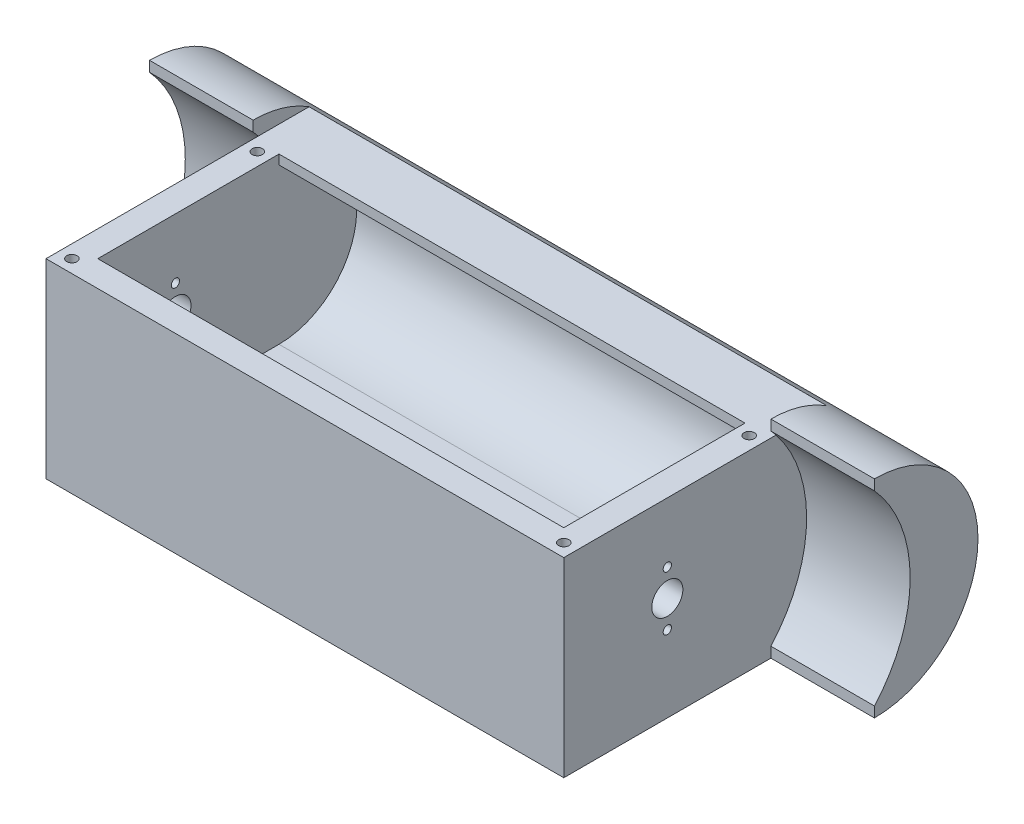
ISO-10303-21;
HEADER;
FILE_DESCRIPTION(('STEP AP214'),'2;1');
FILE_NAME('part.step','',(''),(''),'','','');
FILE_SCHEMA(('AUTOMOTIVE_DESIGN { 1 0 10303 214 1 1 1 1 }'));
ENDSEC;
DATA;
#1=APPLICATION_CONTEXT('core data for automotive mechanical design processes');
#2=APPLICATION_PROTOCOL_DEFINITION('international standard','automotive_design',2000,#1);
#3=PRODUCT_CONTEXT('',#1,'mechanical');
#4=PRODUCT('Part','Part','',(#3));
#5=PRODUCT_RELATED_PRODUCT_CATEGORY('part','',(#4));
#6=PRODUCT_DEFINITION_FORMATION('','',#4);
#7=PRODUCT_DEFINITION_CONTEXT('part definition',#1,'design');
#8=PRODUCT_DEFINITION('design','',#6,#7);
#9=PRODUCT_DEFINITION_SHAPE('','',#8);
#10=(LENGTH_UNIT() NAMED_UNIT(*) SI_UNIT(.MILLI.,.METRE.));
#11=(NAMED_UNIT(*) PLANE_ANGLE_UNIT() SI_UNIT($,.RADIAN.));
#12=(NAMED_UNIT(*) SI_UNIT($,.STERADIAN.) SOLID_ANGLE_UNIT());
#13=UNCERTAINTY_MEASURE_WITH_UNIT(LENGTH_MEASURE(1.E-05),#10,'distance_accuracy_value','');
#14=(GEOMETRIC_REPRESENTATION_CONTEXT(3) GLOBAL_UNCERTAINTY_ASSIGNED_CONTEXT((#13)) GLOBAL_UNIT_ASSIGNED_CONTEXT((#10,
#11,#12)) REPRESENTATION_CONTEXT('',''));
#15=CARTESIAN_POINT('',(0.,0.,0.));
#16=DIRECTION('',(0.,0.,1.));
#17=DIRECTION('',(1.,0.,0.));
#18=AXIS2_PLACEMENT_3D('',#15,#16,#17);
#19=CARTESIAN_POINT('',(-20.,20.,-20.));
#20=DIRECTION('',(0.,0.,1.));
#21=DIRECTION('',(0.,-1.,0.));
#22=AXIS2_PLACEMENT_3D('',#19,#20,#21);
#23=PLANE('',#22);
#24=DIRECTION('',(-1.,0.,0.));
#25=VECTOR('',#24,1.);
#26=CARTESIAN_POINT('',(36.634000600535,17.9891634046723,-20.));
#27=LINE('',#26,#25);
#28=CARTESIAN_POINT('',(0.,17.9891634046723,-20.));
#29=VERTEX_POINT('',#28);
#30=CARTESIAN_POINT('',(-20.,17.9891634046723,-20.));
#31=VERTEX_POINT('',#30);
#32=EDGE_CURVE('E183',#29,#31,#27,.T.);
#33=ORIENTED_EDGE('',*,*,#32,.F.);
#34=DIRECTION('',(0.,-1.,0.));
#35=VECTOR('',#34,1.);
#36=CARTESIAN_POINT('',(0.,20.,-20.));
#37=LINE('',#36,#35);
#38=CARTESIAN_POINT('',(0.,20.,-20.));
#39=VERTEX_POINT('',#38);
#40=EDGE_CURVE('E208',#39,#29,#37,.T.);
#41=ORIENTED_EDGE('',*,*,#40,.F.);
#42=DIRECTION('',(1.,0.,0.));
#43=VECTOR('',#42,1.);
#44=CARTESIAN_POINT('',(-20.,20.,-20.));
#45=LINE('',#44,#43);
#46=CARTESIAN_POINT('',(-20.,20.,-20.));
#47=VERTEX_POINT('',#46);
#48=EDGE_CURVE('E207',#47,#39,#45,.T.);
#49=ORIENTED_EDGE('',*,*,#48,.F.);
#50=DIRECTION('',(0.,-1.,0.));
#51=VECTOR('',#50,1.);
#52=CARTESIAN_POINT('',(-20.,20.,-20.));
#53=LINE('',#52,#51);
#54=EDGE_CURVE('E203',#47,#31,#53,.T.);
#55=ORIENTED_EDGE('',*,*,#54,.T.);
#56=EDGE_LOOP('',(#33,#41,#49,#55));
#57=FACE_BOUND('',#56,.T.);
#58=ADVANCED_FACE('F48',(#57),#23,.T.);
#59=CARTESIAN_POINT('',(120.,20.,-20.));
#60=DIRECTION('',(0.,0.,-1.));
#61=DIRECTION('',(0.,1.,0.));
#62=AXIS2_PLACEMENT_3D('',#59,#60,#61);
#63=PLANE('',#62);
#64=DIRECTION('',(0.,-1.,0.));
#65=VECTOR('',#64,1.);
#66=CARTESIAN_POINT('',(100.,20.,-20.));
#67=LINE('',#66,#65);
#68=CARTESIAN_POINT('',(100.,20.,-20.));
#69=VERTEX_POINT('',#68);
#70=CARTESIAN_POINT('',(100.,17.9891634046723,-20.));
#71=VERTEX_POINT('',#70);
#72=EDGE_CURVE('E227',#69,#71,#67,.T.);
#73=ORIENTED_EDGE('',*,*,#72,.T.);
#74=DIRECTION('',(1.,0.,0.));
#75=VECTOR('',#74,1.);
#76=CARTESIAN_POINT('',(63.365999399465,17.9891634046723,-20.));
#77=LINE('',#76,#75);
#78=CARTESIAN_POINT('',(120.,17.9891634046723,-20.));
#79=VERTEX_POINT('',#78);
#80=EDGE_CURVE('E416',#71,#79,#77,.T.);
#81=ORIENTED_EDGE('',*,*,#80,.T.);
#82=DIRECTION('',(0.,-1.,0.));
#83=VECTOR('',#82,1.);
#84=CARTESIAN_POINT('',(120.,20.,-20.));
#85=LINE('',#84,#83);
#86=CARTESIAN_POINT('',(120.,20.,-20.));
#87=VERTEX_POINT('',#86);
#88=EDGE_CURVE('E228',#87,#79,#85,.T.);
#89=ORIENTED_EDGE('',*,*,#88,.F.);
#90=DIRECTION('',(-1.,0.,0.));
#91=VECTOR('',#90,1.);
#92=CARTESIAN_POINT('',(120.,20.,-20.));
#93=LINE('',#92,#91);
#94=EDGE_CURVE('E239',#87,#69,#93,.T.);
#95=ORIENTED_EDGE('',*,*,#94,.T.);
#96=EDGE_LOOP('',(#73,#81,#89,#95));
#97=FACE_BOUND('',#96,.T.);
#98=ADVANCED_FACE('F503',(#97),#63,.F.);
#99=CARTESIAN_POINT('',(0.,0.,-20.));
#100=DIRECTION('',(-1.,0.,0.));
#101=DIRECTION('',(0.,0.,1.));
#102=AXIS2_PLACEMENT_3D('',#99,#100,#101);
#103=PLANE('',#102);
#104=CARTESIAN_POINT('',(0.,-5.25,0.));
#105=DIRECTION('',(-1.,0.,0.));
#106=DIRECTION('',(0.,0.,1.));
#107=AXIS2_PLACEMENT_3D('',#104,#105,#106);
#108=CIRCLE('',#107,0.8);
#109=CARTESIAN_POINT('',(0.,-5.25,0.799999999999998));
#110=VERTEX_POINT('',#109);
#111=EDGE_CURVE('E311',#110,#110,#108,.F.);
#112=ORIENTED_EDGE('',*,*,#111,.T.);
#113=EDGE_LOOP('',(#112));
#114=FACE_BOUND('',#113,.T.);
#115=CARTESIAN_POINT('',(0.,0.,0.));
#116=DIRECTION('',(-1.,0.,0.));
#117=DIRECTION('',(0.,0.,1.));
#118=AXIS2_PLACEMENT_3D('',#115,#116,#117);
#119=CIRCLE('',#118,3.);
#120=CARTESIAN_POINT('',(0.,0.,3.));
#121=VERTEX_POINT('',#120);
#122=EDGE_CURVE('E461',#121,#121,#119,.F.);
#123=ORIENTED_EDGE('',*,*,#122,.T.);
#124=EDGE_LOOP('',(#123));
#125=FACE_BOUND('',#124,.T.);
#126=CARTESIAN_POINT('',(0.,5.25,0.));
#127=DIRECTION('',(-1.,0.,0.));
#128=DIRECTION('',(0.,0.,1.));
#129=AXIS2_PLACEMENT_3D('',#126,#127,#128);
#130=CIRCLE('',#129,0.8);
#131=CARTESIAN_POINT('',(0.,5.25,0.799999999999998));
#132=VERTEX_POINT('',#131);
#133=EDGE_CURVE('E449',#132,#132,#130,.F.);
#134=ORIENTED_EDGE('',*,*,#133,.T.);
#135=EDGE_LOOP('',(#134));
#136=FACE_BOUND('',#135,.T.);
#137=DIRECTION('',(0.,-1.,0.));
#138=VECTOR('',#137,1.);
#139=CARTESIAN_POINT('',(0.,20.,20.));
#140=LINE('',#139,#138);
#141=CARTESIAN_POINT('',(0.,16.825,20.));
#142=VERTEX_POINT('',#141);
#143=CARTESIAN_POINT('',(0.,-20.,20.));
#144=VERTEX_POINT('',#143);
#145=EDGE_CURVE('E276',#142,#144,#140,.T.);
#146=ORIENTED_EDGE('',*,*,#145,.F.);
#147=DIRECTION('',(0.,0.,1.));
#148=VECTOR('',#147,1.);
#149=CARTESIAN_POINT('',(0.,16.825,-30.81));
#150=LINE('',#149,#148);
#151=CARTESIAN_POINT('',(0.,16.825,-20.9887916517364));
#152=VERTEX_POINT('',#151);
#153=EDGE_CURVE('E334',#152,#142,#150,.T.);
#154=ORIENTED_EDGE('',*,*,#153,.F.);
#155=CARTESIAN_POINT('',(0.,0.,0.));
#156=DIRECTION('',(-1.,0.,0.));
#157=DIRECTION('',(0.,0.,1.));
#158=AXIS2_PLACEMENT_3D('',#155,#156,#157);
#159=CIRCLE('',#158,26.9);
#160=CARTESIAN_POINT('',(0.,-17.9891634046723,-20.));
#161=VERTEX_POINT('',#160);
#162=EDGE_CURVE('E381',#161,#152,#159,.F.);
#163=ORIENTED_EDGE('',*,*,#162,.F.);
#164=CARTESIAN_POINT('',(0.,-20.,-20.));
#165=VERTEX_POINT('',#164);
#166=EDGE_CURVE('E195',#161,#165,#37,.T.);
#167=ORIENTED_EDGE('',*,*,#166,.T.);
#168=DIRECTION('',(0.,0.,-1.));
#169=VECTOR('',#168,1.);
#170=CARTESIAN_POINT('',(0.,-20.,20.));
#171=LINE('',#170,#169);
#172=EDGE_CURVE('E288',#144,#165,#171,.T.);
#173=ORIENTED_EDGE('',*,*,#172,.F.);
#174=EDGE_LOOP('',(#146,#154,#163,#167,#173));
#175=FACE_BOUND('',#174,.T.);
#176=ADVANCED_FACE('F380',(#114,#125,#136,#175),#103,.T.);
#177=CARTESIAN_POINT('',(100.,0.,-20.));
#178=DIRECTION('',(-1.,0.,0.));
#179=DIRECTION('',(0.,0.,1.));
#180=AXIS2_PLACEMENT_3D('',#177,#178,#179);
#181=PLANE('',#180);
#182=CARTESIAN_POINT('',(100.,-5.25,0.));
#183=DIRECTION('',(1.,0.,0.));
#184=DIRECTION('',(0.,0.,1.));
#185=AXIS2_PLACEMENT_3D('',#182,#183,#184);
#186=CIRCLE('',#185,0.8);
#187=CARTESIAN_POINT('',(100.,-5.25,0.799999999999998));
#188=VERTEX_POINT('',#187);
#189=EDGE_CURVE('E453',#188,#188,#186,.T.);
#190=ORIENTED_EDGE('',*,*,#189,.F.);
#191=EDGE_LOOP('',(#190));
#192=FACE_BOUND('',#191,.T.);
#193=CARTESIAN_POINT('',(100.,0.,0.));
#194=DIRECTION('',(1.,0.,0.));
#195=DIRECTION('',(0.,0.,-1.));
#196=AXIS2_PLACEMENT_3D('',#193,#194,#195);
#197=CIRCLE('',#196,3.);
#198=CARTESIAN_POINT('',(100.,0.,-3.));
#199=VERTEX_POINT('',#198);
#200=EDGE_CURVE('E457',#199,#199,#197,.T.);
#201=ORIENTED_EDGE('',*,*,#200,.F.);
#202=EDGE_LOOP('',(#201));
#203=FACE_BOUND('',#202,.T.);
#204=CARTESIAN_POINT('',(100.,5.25,0.));
#205=DIRECTION('',(1.,0.,0.));
#206=DIRECTION('',(0.,0.,-1.));
#207=AXIS2_PLACEMENT_3D('',#204,#205,#206);
#208=CIRCLE('',#207,0.8);
#209=CARTESIAN_POINT('',(100.,5.25,-0.800000000000002));
#210=VERTEX_POINT('',#209);
#211=EDGE_CURVE('E327',#210,#210,#208,.T.);
#212=ORIENTED_EDGE('',*,*,#211,.F.);
#213=EDGE_LOOP('',(#212));
#214=FACE_BOUND('',#213,.T.);
#215=DIRECTION('',(0.,0.,-1.));
#216=VECTOR('',#215,1.);
#217=CARTESIAN_POINT('',(100.,16.825,-30.81));
#218=LINE('',#217,#216);
#219=CARTESIAN_POINT('',(100.,16.825,20.));
#220=VERTEX_POINT('',#219);
#221=CARTESIAN_POINT('',(100.,16.825,-20.9887916517364));
#222=VERTEX_POINT('',#221);
#223=EDGE_CURVE('E346',#220,#222,#218,.T.);
#224=ORIENTED_EDGE('',*,*,#223,.F.);
#225=DIRECTION('',(0.,-1.,0.));
#226=VECTOR('',#225,1.);
#227=CARTESIAN_POINT('',(100.,20.,20.));
#228=LINE('',#227,#226);
#229=CARTESIAN_POINT('',(100.,-20.,20.));
#230=VERTEX_POINT('',#229);
#231=EDGE_CURVE('E284',#220,#230,#228,.T.);
#232=ORIENTED_EDGE('',*,*,#231,.T.);
#233=DIRECTION('',(0.,0.,-1.));
#234=VECTOR('',#233,1.);
#235=CARTESIAN_POINT('',(100.,-20.,20.));
#236=LINE('',#235,#234);
#237=CARTESIAN_POINT('',(100.,-20.,-20.));
#238=VERTEX_POINT('',#237);
#239=EDGE_CURVE('E287',#230,#238,#236,.T.);
#240=ORIENTED_EDGE('',*,*,#239,.T.);
#241=CARTESIAN_POINT('',(100.,-17.9891634046723,-20.));
#242=VERTEX_POINT('',#241);
#243=EDGE_CURVE('E221',#242,#238,#67,.T.);
#244=ORIENTED_EDGE('',*,*,#243,.F.);
#245=CARTESIAN_POINT('',(100.,0.,0.));
#246=DIRECTION('',(-1.,0.,0.));
#247=DIRECTION('',(0.,0.,1.));
#248=AXIS2_PLACEMENT_3D('',#245,#246,#247);
#249=CIRCLE('',#248,26.9);
#250=EDGE_CURVE('E66',#242,#222,#249,.F.);
#251=ORIENTED_EDGE('',*,*,#250,.T.);
#252=EDGE_LOOP('',(#224,#232,#240,#244,#251));
#253=FACE_BOUND('',#252,.T.);
#254=ADVANCED_FACE('F477',(#192,#203,#214,#253),#181,.F.);
#255=CARTESIAN_POINT('',(100.,20.,20.));
#256=DIRECTION('',(0.,0.,-1.));
#257=DIRECTION('',(0.,1.,0.));
#258=AXIS2_PLACEMENT_3D('',#255,#256,#257);
#259=PLANE('',#258);
#260=DIRECTION('',(1.,0.,0.));
#261=VECTOR('',#260,1.);
#262=CARTESIAN_POINT('',(0.,16.825,20.));
#263=LINE('',#262,#261);
#264=EDGE_CURVE('E339',#142,#220,#263,.T.);
#265=ORIENTED_EDGE('',*,*,#264,.F.);
#266=ORIENTED_EDGE('',*,*,#145,.T.);
#267=DIRECTION('',(-1.,0.,0.));
#268=VECTOR('',#267,1.);
#269=CARTESIAN_POINT('',(100.,-20.,20.));
#270=LINE('',#269,#268);
#271=EDGE_CURVE('E301',#230,#144,#270,.T.);
#272=ORIENTED_EDGE('',*,*,#271,.F.);
#273=ORIENTED_EDGE('',*,*,#231,.F.);
#274=EDGE_LOOP('',(#265,#266,#272,#273));
#275=FACE_BOUND('',#274,.T.);
#276=ADVANCED_FACE('F50',(#275),#259,.F.);
#277=CARTESIAN_POINT('',(100.,-20.,20.));
#278=DIRECTION('',(0.,1.,0.));
#279=DIRECTION('',(0.,0.,1.));
#280=AXIS2_PLACEMENT_3D('',#277,#278,#279);
#281=PLANE('',#280);
#282=ORIENTED_EDGE('',*,*,#172,.T.);
#283=DIRECTION('',(-1.,0.,0.));
#284=VECTOR('',#283,1.);
#285=CARTESIAN_POINT('',(100.,-20.,-20.));
#286=LINE('',#285,#284);
#287=EDGE_CURVE('E292',#238,#165,#286,.T.);
#288=ORIENTED_EDGE('',*,*,#287,.F.);
#289=ORIENTED_EDGE('',*,*,#239,.F.);
#290=ORIENTED_EDGE('',*,*,#271,.T.);
#291=EDGE_LOOP('',(#282,#288,#289,#290));
#292=FACE_BOUND('',#291,.T.);
#293=ADVANCED_FACE('F385',(#292),#281,.F.);
#294=CARTESIAN_POINT('',(100.,0.,-20.));
#295=DIRECTION('',(-1.,0.,0.));
#296=DIRECTION('',(0.,0.,1.));
#297=AXIS2_PLACEMENT_3D('',#294,#295,#296);
#298=CYLINDRICAL_SURFACE('',#297,20.);
#299=ORIENTED_EDGE('',*,*,#48,.T.);
#300=CARTESIAN_POINT('',(0.,0.,-20.));
#301=DIRECTION('',(-1.,0.,0.));
#302=DIRECTION('',(0.,0.,1.));
#303=AXIS2_PLACEMENT_3D('',#300,#301,#302);
#304=CIRCLE('',#303,20.);
#305=CARTESIAN_POINT('',(0.,16.8268802812643,-30.81));
#306=VERTEX_POINT('',#305);
#307=EDGE_CURVE('E356',#39,#306,#304,.T.);
#308=ORIENTED_EDGE('',*,*,#307,.T.);
#309=DIRECTION('',(-1.,0.,0.));
#310=VECTOR('',#309,1.);
#311=CARTESIAN_POINT('',(100.,16.8268802812643,-30.81));
#312=LINE('',#311,#310);
#313=CARTESIAN_POINT('',(100.,16.8268802812643,-30.81));
#314=VERTEX_POINT('',#313);
#315=EDGE_CURVE('E12',#306,#314,#312,.F.);
#316=ORIENTED_EDGE('',*,*,#315,.T.);
#317=CARTESIAN_POINT('',(100.,0.,-20.));
#318=DIRECTION('',(1.,0.,0.));
#319=DIRECTION('',(0.,0.,-1.));
#320=AXIS2_PLACEMENT_3D('',#317,#318,#319);
#321=CIRCLE('',#320,20.);
#322=EDGE_CURVE('E363',#314,#69,#321,.T.);
#323=ORIENTED_EDGE('',*,*,#322,.T.);
#324=ORIENTED_EDGE('',*,*,#94,.F.);
#325=CARTESIAN_POINT('',(120.,0.,-20.));
#326=DIRECTION('',(1.,0.,0.));
#327=DIRECTION('',(0.,0.,1.));
#328=AXIS2_PLACEMENT_3D('',#325,#326,#327);
#329=CIRCLE('',#328,20.);
#330=CARTESIAN_POINT('',(120.,-20.,-20.));
#331=VERTEX_POINT('',#330);
#332=EDGE_CURVE('E222',#331,#87,#329,.T.);
#333=ORIENTED_EDGE('',*,*,#332,.F.);
#334=DIRECTION('',(-1.,0.,0.));
#335=VECTOR('',#334,1.);
#336=CARTESIAN_POINT('',(120.,-20.,-20.));
#337=LINE('',#336,#335);
#338=EDGE_CURVE('E232',#331,#238,#337,.T.);
#339=ORIENTED_EDGE('',*,*,#338,.T.);
#340=ORIENTED_EDGE('',*,*,#287,.T.);
#341=DIRECTION('',(1.,0.,0.));
#342=VECTOR('',#341,1.);
#343=CARTESIAN_POINT('',(-20.,-20.,-20.));
#344=LINE('',#343,#342);
#345=CARTESIAN_POINT('',(-20.,-20.,-20.));
#346=VERTEX_POINT('',#345);
#347=EDGE_CURVE('E218',#346,#165,#344,.T.);
#348=ORIENTED_EDGE('',*,*,#347,.F.);
#349=CARTESIAN_POINT('',(-20.,0.,-20.));
#350=DIRECTION('',(1.,0.,0.));
#351=DIRECTION('',(0.,0.,1.));
#352=AXIS2_PLACEMENT_3D('',#349,#350,#351);
#353=CIRCLE('',#352,20.);
#354=EDGE_CURVE('E201',#346,#47,#353,.T.);
#355=ORIENTED_EDGE('',*,*,#354,.T.);
#356=EDGE_LOOP('',(#299,#308,#316,#323,#324,#333,#339,#340,#348,#355));
#357=FACE_BOUND('',#356,.T.);
#358=ADVANCED_FACE('F388',(#357),#298,.T.);
#359=CARTESIAN_POINT('',(120.,-17.9891634046723,-20.));
#360=VERTEX_POINT('',#359);
#361=EDGE_CURVE('E226',#360,#331,#85,.T.);
#362=ORIENTED_EDGE('',*,*,#361,.F.);
#363=DIRECTION('',(1.,0.,0.));
#364=VECTOR('',#363,1.);
#365=CARTESIAN_POINT('',(63.365999399465,-17.9891634046723,-20.));
#366=LINE('',#365,#364);
#367=EDGE_CURVE('E396',#242,#360,#366,.T.);
#368=ORIENTED_EDGE('',*,*,#367,.F.);
#369=ORIENTED_EDGE('',*,*,#243,.T.);
#370=ORIENTED_EDGE('',*,*,#338,.F.);
#371=EDGE_LOOP('',(#362,#368,#369,#370));
#372=FACE_BOUND('',#371,.T.);
#373=ADVANCED_FACE('F394',(#372),#63,.F.);
#374=CARTESIAN_POINT('',(120.,0.,-20.));
#375=DIRECTION('',(-1.,0.,0.));
#376=DIRECTION('',(0.,0.,1.));
#377=AXIS2_PLACEMENT_3D('',#374,#375,#376);
#378=PLANE('',#377);
#379=ORIENTED_EDGE('',*,*,#88,.T.);
#380=CARTESIAN_POINT('',(120.,0.,0.));
#381=DIRECTION('',(1.,0.,0.));
#382=DIRECTION('',(0.,0.,-1.));
#383=AXIS2_PLACEMENT_3D('',#380,#381,#382);
#384=CIRCLE('',#383,26.9);
#385=EDGE_CURVE('E402',#360,#79,#384,.T.);
#386=ORIENTED_EDGE('',*,*,#385,.F.);
#387=ORIENTED_EDGE('',*,*,#361,.T.);
#388=ORIENTED_EDGE('',*,*,#332,.T.);
#389=EDGE_LOOP('',(#379,#386,#387,#388));
#390=FACE_BOUND('',#389,.T.);
#391=ADVANCED_FACE('F401',(#390),#378,.F.);
#392=DIRECTION('',(-1.,0.,0.));
#393=VECTOR('',#392,1.);
#394=CARTESIAN_POINT('',(36.634000600535,-17.9891634046723,-20.));
#395=LINE('',#394,#393);
#396=CARTESIAN_POINT('',(-20.,-17.9891634046723,-20.));
#397=VERTEX_POINT('',#396);
#398=EDGE_CURVE('E180',#161,#397,#395,.T.);
#399=ORIENTED_EDGE('',*,*,#398,.T.);
#400=EDGE_CURVE('E193',#397,#346,#53,.T.);
#401=ORIENTED_EDGE('',*,*,#400,.T.);
#402=ORIENTED_EDGE('',*,*,#347,.T.);
#403=ORIENTED_EDGE('',*,*,#166,.F.);
#404=EDGE_LOOP('',(#399,#401,#402,#403));
#405=FACE_BOUND('',#404,.T.);
#406=ADVANCED_FACE('F191',(#405),#23,.T.);
#407=CARTESIAN_POINT('',(-20.,0.,-20.));
#408=DIRECTION('',(1.,0.,0.));
#409=DIRECTION('',(0.,0.,1.));
#410=AXIS2_PLACEMENT_3D('',#407,#408,#409);
#411=PLANE('',#410);
#412=ORIENTED_EDGE('',*,*,#400,.F.);
#413=CARTESIAN_POINT('',(-20.,0.,0.));
#414=DIRECTION('',(-1.,0.,0.));
#415=DIRECTION('',(0.,0.,1.));
#416=AXIS2_PLACEMENT_3D('',#413,#414,#415);
#417=CIRCLE('',#416,26.9);
#418=EDGE_CURVE('E176',#31,#397,#417,.T.);
#419=ORIENTED_EDGE('',*,*,#418,.F.);
#420=ORIENTED_EDGE('',*,*,#54,.F.);
#421=ORIENTED_EDGE('',*,*,#354,.F.);
#422=EDGE_LOOP('',(#412,#419,#420,#421));
#423=FACE_BOUND('',#422,.T.);
#424=ADVANCED_FACE('F199',(#423),#411,.F.);
#425=CARTESIAN_POINT('',(0.,16.825,-30.81));
#426=DIRECTION('',(0.,0.,-1.));
#427=DIRECTION('',(-1.,0.,0.));
#428=AXIS2_PLACEMENT_3D('',#425,#426,#427);
#429=PLANE('',#428);
#430=DIRECTION('',(0.,1.,0.));
#431=VECTOR('',#430,1.);
#432=CARTESIAN_POINT('',(0.,16.825,-30.81));
#433=LINE('',#432,#431);
#434=CARTESIAN_POINT('',(0.,16.825,-30.81));
#435=VERTEX_POINT('',#434);
#436=EDGE_CURVE('E352',#435,#306,#433,.T.);
#437=ORIENTED_EDGE('',*,*,#436,.F.);
#438=DIRECTION('',(-1.,0.,0.));
#439=VECTOR('',#438,1.);
#440=CARTESIAN_POINT('',(0.,16.825,-30.81));
#441=LINE('',#440,#439);
#442=CARTESIAN_POINT('',(100.,16.825,-30.81));
#443=VERTEX_POINT('',#442);
#444=EDGE_CURVE('E347',#443,#435,#441,.T.);
#445=ORIENTED_EDGE('',*,*,#444,.F.);
#446=DIRECTION('',(0.,1.,0.));
#447=VECTOR('',#446,1.);
#448=CARTESIAN_POINT('',(100.,16.825,-30.81));
#449=LINE('',#448,#447);
#450=EDGE_CURVE('E351',#443,#314,#449,.T.);
#451=ORIENTED_EDGE('',*,*,#450,.T.);
#452=ORIENTED_EDGE('',*,*,#315,.F.);
#453=EDGE_LOOP('',(#437,#445,#451,#452));
#454=FACE_BOUND('',#453,.T.);
#455=ADVANCED_FACE('F499',(#454),#429,.F.);
#456=CARTESIAN_POINT('',(100.,16.825,-30.81));
#457=DIRECTION('',(1.,0.,0.));
#458=DIRECTION('',(0.,0.,-1.));
#459=AXIS2_PLACEMENT_3D('',#456,#457,#458);
#460=PLANE('',#459);
#461=EDGE_CURVE('E343',#222,#443,#218,.T.);
#462=ORIENTED_EDGE('',*,*,#461,.F.);
#463=EDGE_CURVE('E409',#222,#71,#249,.F.);
#464=ORIENTED_EDGE('',*,*,#463,.T.);
#465=ORIENTED_EDGE('',*,*,#72,.F.);
#466=ORIENTED_EDGE('',*,*,#322,.F.);
#467=ORIENTED_EDGE('',*,*,#450,.F.);
#468=EDGE_LOOP('',(#462,#464,#465,#466,#467));
#469=FACE_BOUND('',#468,.T.);
#470=ADVANCED_FACE('F620',(#469),#460,.F.);
#471=CARTESIAN_POINT('',(0.,16.825,-30.81));
#472=DIRECTION('',(-1.,0.,0.));
#473=DIRECTION('',(0.,0.,1.));
#474=AXIS2_PLACEMENT_3D('',#471,#472,#473);
#475=PLANE('',#474);
#476=ORIENTED_EDGE('',*,*,#40,.T.);
#477=EDGE_CURVE('E411',#152,#29,#159,.F.);
#478=ORIENTED_EDGE('',*,*,#477,.F.);
#479=EDGE_CURVE('E335',#435,#152,#150,.T.);
#480=ORIENTED_EDGE('',*,*,#479,.F.);
#481=ORIENTED_EDGE('',*,*,#436,.T.);
#482=ORIENTED_EDGE('',*,*,#307,.F.);
#483=EDGE_LOOP('',(#476,#478,#480,#481,#482));
#484=FACE_BOUND('',#483,.T.);
#485=ADVANCED_FACE('F492',(#484),#475,.F.);
#486=CARTESIAN_POINT('',(0.,16.825,0.));
#487=DIRECTION('',(0.,1.,0.));
#488=DIRECTION('',(0.,0.,1.));
#489=AXIS2_PLACEMENT_3D('',#486,#487,#488);
#490=PLANE('',#489);
#491=CARTESIAN_POINT('',(97.5,16.825,-18.31));
#492=DIRECTION('',(0.,1.,0.));
#493=DIRECTION('',(0.,0.,1.));
#494=AXIS2_PLACEMENT_3D('',#491,#492,#493);
#495=CIRCLE('',#494,0.999999999999998);
#496=CARTESIAN_POINT('',(97.5,16.825,-17.31));
#497=VERTEX_POINT('',#496);
#498=EDGE_CURVE('E429',#497,#497,#495,.T.);
#499=ORIENTED_EDGE('',*,*,#498,.F.);
#500=EDGE_LOOP('',(#499));
#501=FACE_BOUND('',#500,.T.);
#502=CARTESIAN_POINT('',(2.50000000000002,16.825,17.5));
#503=DIRECTION('',(0.,1.,0.));
#504=DIRECTION('',(0.,0.,-1.));
#505=AXIS2_PLACEMENT_3D('',#502,#503,#504);
#506=CIRCLE('',#505,0.999999999999999);
#507=CARTESIAN_POINT('',(2.50000000000002,16.825,16.5));
#508=VERTEX_POINT('',#507);
#509=EDGE_CURVE('E438',#508,#508,#506,.T.);
#510=ORIENTED_EDGE('',*,*,#509,.F.);
#511=EDGE_LOOP('',(#510));
#512=FACE_BOUND('',#511,.T.);
#513=CARTESIAN_POINT('',(2.50000000000002,16.825,-18.31));
#514=DIRECTION('',(0.,1.,0.));
#515=DIRECTION('',(0.,0.,-1.));
#516=AXIS2_PLACEMENT_3D('',#513,#514,#515);
#517=CIRCLE('',#516,0.999999999999999);
#518=CARTESIAN_POINT('',(2.50000000000002,16.825,-19.31));
#519=VERTEX_POINT('',#518);
#520=EDGE_CURVE('E421',#519,#519,#517,.T.);
#521=ORIENTED_EDGE('',*,*,#520,.F.);
#522=EDGE_LOOP('',(#521));
#523=FACE_BOUND('',#522,.T.);
#524=CARTESIAN_POINT('',(97.5,16.825,17.5));
#525=DIRECTION('',(0.,1.,0.));
#526=DIRECTION('',(0.,0.,1.));
#527=AXIS2_PLACEMENT_3D('',#524,#525,#526);
#528=CIRCLE('',#527,0.999999999999998);
#529=CARTESIAN_POINT('',(97.5,16.825,18.5));
#530=VERTEX_POINT('',#529);
#531=EDGE_CURVE('E433',#530,#530,#528,.T.);
#532=ORIENTED_EDGE('',*,*,#531,.F.);
#533=EDGE_LOOP('',(#532));
#534=FACE_BOUND('',#533,.T.);
#535=DIRECTION('',(1.,0.,0.));
#536=VECTOR('',#535,1.);
#537=CARTESIAN_POINT('',(100.,16.825,15.));
#538=LINE('',#537,#536);
#539=CARTESIAN_POINT('',(5.,16.825,15.));
#540=VERTEX_POINT('',#539);
#541=CARTESIAN_POINT('',(95.,16.825,15.));
#542=VERTEX_POINT('',#541);
#543=EDGE_CURVE('E74',#540,#542,#538,.T.);
#544=ORIENTED_EDGE('',*,*,#543,.F.);
#545=DIRECTION('',(0.,0.,-1.));
#546=VECTOR('',#545,1.);
#547=CARTESIAN_POINT('',(5.,16.825,-20.));
#548=LINE('',#547,#546);
#549=CARTESIAN_POINT('',(5.,16.825,-20.));
#550=VERTEX_POINT('',#549);
#551=EDGE_CURVE('E58',#540,#550,#548,.T.);
#552=ORIENTED_EDGE('',*,*,#551,.T.);
#553=DIRECTION('',(-1.,0.,0.));
#554=VECTOR('',#553,1.);
#555=CARTESIAN_POINT('',(100.,16.825,-20.));
#556=LINE('',#555,#554);
#557=CARTESIAN_POINT('',(95.,16.825,-20.));
#558=VERTEX_POINT('',#557);
#559=EDGE_CURVE('E369',#550,#558,#556,.F.);
#560=ORIENTED_EDGE('',*,*,#559,.T.);
#561=DIRECTION('',(0.,0.,-1.));
#562=VECTOR('',#561,1.);
#563=CARTESIAN_POINT('',(95.,16.825,-20.));
#564=LINE('',#563,#562);
#565=EDGE_CURVE('E371',#542,#558,#564,.T.);
#566=ORIENTED_EDGE('',*,*,#565,.F.);
#567=EDGE_LOOP('',(#544,#552,#560,#566));
#568=FACE_BOUND('',#567,.T.);
#569=ORIENTED_EDGE('',*,*,#479,.T.);
#570=ORIENTED_EDGE('',*,*,#153,.T.);
#571=ORIENTED_EDGE('',*,*,#264,.T.);
#572=ORIENTED_EDGE('',*,*,#223,.T.);
#573=ORIENTED_EDGE('',*,*,#461,.T.);
#574=ORIENTED_EDGE('',*,*,#444,.T.);
#575=EDGE_LOOP('',(#569,#570,#571,#572,#573,#574));
#576=FACE_BOUND('',#575,.T.);
#577=ADVANCED_FACE('F486',(#501,#512,#523,#534,#568,#576),#490,.T.);
#578=CARTESIAN_POINT('',(100.,0.,-20.));
#579=DIRECTION('',(-1.,0.,0.));
#580=DIRECTION('',(0.,0.,1.));
#581=AXIS2_PLACEMENT_3D('',#578,#579,#580);
#582=CYLINDRICAL_SURFACE('',#581,15.);
#583=CARTESIAN_POINT('',(5.,0.,-20.));
#584=DIRECTION('',(-1.,0.,0.));
#585=DIRECTION('',(0.,0.,1.));
#586=AXIS2_PLACEMENT_3D('',#583,#584,#585);
#587=CIRCLE('',#586,15.);
#588=CARTESIAN_POINT('',(5.,-15.,-20.));
#589=VERTEX_POINT('',#588);
#590=CARTESIAN_POINT('',(5.,15.,-20.));
#591=VERTEX_POINT('',#590);
#592=EDGE_CURVE('E257',#589,#591,#587,.F.);
#593=ORIENTED_EDGE('',*,*,#592,.F.);
#594=DIRECTION('',(-1.,0.,0.));
#595=VECTOR('',#594,1.);
#596=CARTESIAN_POINT('',(100.,-15.,-20.));
#597=LINE('',#596,#595);
#598=CARTESIAN_POINT('',(95.,-15.,-20.));
#599=VERTEX_POINT('',#598);
#600=EDGE_CURVE('E252',#599,#589,#597,.T.);
#601=ORIENTED_EDGE('',*,*,#600,.F.);
#602=CARTESIAN_POINT('',(95.,0.,-20.));
#603=DIRECTION('',(-1.,0.,0.));
#604=DIRECTION('',(0.,0.,1.));
#605=AXIS2_PLACEMENT_3D('',#602,#603,#604);
#606=CIRCLE('',#605,15.);
#607=CARTESIAN_POINT('',(95.,15.,-20.));
#608=VERTEX_POINT('',#607);
#609=EDGE_CURVE('E263',#599,#608,#606,.F.);
#610=ORIENTED_EDGE('',*,*,#609,.T.);
#611=DIRECTION('',(-1.,0.,0.));
#612=VECTOR('',#611,1.);
#613=CARTESIAN_POINT('',(50.,15.,-20.));
#614=LINE('',#613,#612);
#615=EDGE_CURVE('E251',#608,#591,#614,.T.);
#616=ORIENTED_EDGE('',*,*,#615,.T.);
#617=EDGE_LOOP('',(#593,#601,#610,#616));
#618=FACE_BOUND('',#617,.T.);
#619=ADVANCED_FACE('F538',(#618),#582,.F.);
#620=CARTESIAN_POINT('',(100.,-15.,20.));
#621=DIRECTION('',(0.,1.,0.));
#622=DIRECTION('',(0.,0.,1.));
#623=AXIS2_PLACEMENT_3D('',#620,#621,#622);
#624=PLANE('',#623);
#625=DIRECTION('',(0.,0.,-1.));
#626=VECTOR('',#625,1.);
#627=CARTESIAN_POINT('',(5.,-15.,-20.));
#628=LINE('',#627,#626);
#629=CARTESIAN_POINT('',(5.,-15.,15.));
#630=VERTEX_POINT('',#629);
#631=EDGE_CURVE('E246',#630,#589,#628,.T.);
#632=ORIENTED_EDGE('',*,*,#631,.F.);
#633=DIRECTION('',(-1.,0.,0.));
#634=VECTOR('',#633,1.);
#635=CARTESIAN_POINT('',(100.,-15.,15.));
#636=LINE('',#635,#634);
#637=CARTESIAN_POINT('',(95.,-15.,15.));
#638=VERTEX_POINT('',#637);
#639=EDGE_CURVE('E247',#638,#630,#636,.T.);
#640=ORIENTED_EDGE('',*,*,#639,.F.);
#641=DIRECTION('',(0.,0.,-1.));
#642=VECTOR('',#641,1.);
#643=CARTESIAN_POINT('',(95.,-15.,-20.));
#644=LINE('',#643,#642);
#645=EDGE_CURVE('E256',#638,#599,#644,.T.);
#646=ORIENTED_EDGE('',*,*,#645,.T.);
#647=ORIENTED_EDGE('',*,*,#600,.T.);
#648=EDGE_LOOP('',(#632,#640,#646,#647));
#649=FACE_BOUND('',#648,.T.);
#650=ADVANCED_FACE('F534',(#649),#624,.T.);
#651=CARTESIAN_POINT('',(95.,0.,-20.));
#652=DIRECTION('',(-1.,0.,0.));
#653=DIRECTION('',(0.,0.,1.));
#654=AXIS2_PLACEMENT_3D('',#651,#652,#653);
#655=PLANE('',#654);
#656=CARTESIAN_POINT('',(95.,-5.25,0.));
#657=DIRECTION('',(-1.,0.,0.));
#658=DIRECTION('',(0.,0.,1.));
#659=AXIS2_PLACEMENT_3D('',#656,#657,#658);
#660=CIRCLE('',#659,0.8);
#661=CARTESIAN_POINT('',(95.,-5.25,0.799999999999998));
#662=VERTEX_POINT('',#661);
#663=EDGE_CURVE('E330',#662,#662,#660,.T.);
#664=ORIENTED_EDGE('',*,*,#663,.F.);
#665=EDGE_LOOP('',(#664));
#666=FACE_BOUND('',#665,.T.);
#667=CARTESIAN_POINT('',(95.,0.,0.));
#668=DIRECTION('',(-1.,0.,0.));
#669=DIRECTION('',(0.,0.,1.));
#670=AXIS2_PLACEMENT_3D('',#667,#668,#669);
#671=CIRCLE('',#670,3.);
#672=CARTESIAN_POINT('',(95.,0.,3.));
#673=VERTEX_POINT('',#672);
#674=EDGE_CURVE('E315',#673,#673,#671,.T.);
#675=ORIENTED_EDGE('',*,*,#674,.F.);
#676=EDGE_LOOP('',(#675));
#677=FACE_BOUND('',#676,.T.);
#678=CARTESIAN_POINT('',(95.,5.25,0.));
#679=DIRECTION('',(-1.,0.,0.));
#680=DIRECTION('',(0.,0.,1.));
#681=AXIS2_PLACEMENT_3D('',#678,#679,#680);
#682=CIRCLE('',#681,0.8);
#683=CARTESIAN_POINT('',(95.,5.25,0.799999999999998));
#684=VERTEX_POINT('',#683);
#685=EDGE_CURVE('E310',#684,#684,#682,.T.);
#686=ORIENTED_EDGE('',*,*,#685,.F.);
#687=EDGE_LOOP('',(#686));
#688=FACE_BOUND('',#687,.T.);
#689=DIRECTION('',(0.,-1.,0.));
#690=VECTOR('',#689,1.);
#691=CARTESIAN_POINT('',(95.,0.,15.));
#692=LINE('',#691,#690);
#693=EDGE_CURVE('E253',#542,#638,#692,.T.);
#694=ORIENTED_EDGE('',*,*,#693,.F.);
#695=ORIENTED_EDGE('',*,*,#565,.T.);
#696=DIRECTION('',(0.,-1.,0.));
#697=VECTOR('',#696,1.);
#698=CARTESIAN_POINT('',(95.,20.,-20.));
#699=LINE('',#698,#697);
#700=EDGE_CURVE('E272',#608,#558,#699,.F.);
#701=ORIENTED_EDGE('',*,*,#700,.F.);
#702=ORIENTED_EDGE('',*,*,#609,.F.);
#703=ORIENTED_EDGE('',*,*,#645,.F.);
#704=EDGE_LOOP('',(#694,#695,#701,#702,#703));
#705=FACE_BOUND('',#704,.T.);
#706=ADVANCED_FACE('F537',(#666,#677,#688,#705),#655,.T.);
#707=CARTESIAN_POINT('',(5.,0.,-20.));
#708=DIRECTION('',(-1.,0.,0.));
#709=DIRECTION('',(0.,0.,1.));
#710=AXIS2_PLACEMENT_3D('',#707,#708,#709);
#711=PLANE('',#710);
#712=CARTESIAN_POINT('',(5.,-5.25,0.));
#713=DIRECTION('',(-1.,0.,0.));
#714=DIRECTION('',(0.,0.,1.));
#715=AXIS2_PLACEMENT_3D('',#712,#713,#714);
#716=CIRCLE('',#715,0.8);
#717=CARTESIAN_POINT('',(5.,-5.25,0.799999999999998));
#718=VERTEX_POINT('',#717);
#719=EDGE_CURVE('E52',#718,#718,#716,.T.);
#720=ORIENTED_EDGE('',*,*,#719,.T.);
#721=EDGE_LOOP('',(#720));
#722=FACE_BOUND('',#721,.T.);
#723=CARTESIAN_POINT('',(5.,0.,0.));
#724=DIRECTION('',(-1.,0.,0.));
#725=DIRECTION('',(0.,0.,1.));
#726=AXIS2_PLACEMENT_3D('',#723,#724,#725);
#727=CIRCLE('',#726,3.);
#728=CARTESIAN_POINT('',(5.,0.,3.));
#729=VERTEX_POINT('',#728);
#730=EDGE_CURVE('E312',#729,#729,#727,.T.);
#731=ORIENTED_EDGE('',*,*,#730,.T.);
#732=EDGE_LOOP('',(#731));
#733=FACE_BOUND('',#732,.T.);
#734=CARTESIAN_POINT('',(5.,5.25,0.));
#735=DIRECTION('',(-1.,0.,0.));
#736=DIRECTION('',(0.,0.,1.));
#737=AXIS2_PLACEMENT_3D('',#734,#735,#736);
#738=CIRCLE('',#737,0.8);
#739=CARTESIAN_POINT('',(5.,5.25,0.799999999999998));
#740=VERTEX_POINT('',#739);
#741=EDGE_CURVE('E307',#740,#740,#738,.T.);
#742=ORIENTED_EDGE('',*,*,#741,.T.);
#743=EDGE_LOOP('',(#742));
#744=FACE_BOUND('',#743,.T.);
#745=ORIENTED_EDGE('',*,*,#551,.F.);
#746=DIRECTION('',(0.,-1.,0.));
#747=VECTOR('',#746,1.);
#748=CARTESIAN_POINT('',(5.,0.,15.));
#749=LINE('',#748,#747);
#750=EDGE_CURVE('E243',#540,#630,#749,.T.);
#751=ORIENTED_EDGE('',*,*,#750,.T.);
#752=ORIENTED_EDGE('',*,*,#631,.T.);
#753=ORIENTED_EDGE('',*,*,#592,.T.);
#754=DIRECTION('',(0.,-1.,0.));
#755=VECTOR('',#754,1.);
#756=CARTESIAN_POINT('',(5.,20.,-20.));
#757=LINE('',#756,#755);
#758=EDGE_CURVE('E277',#591,#550,#757,.F.);
#759=ORIENTED_EDGE('',*,*,#758,.T.);
#760=EDGE_LOOP('',(#745,#751,#752,#753,#759));
#761=FACE_BOUND('',#760,.T.);
#762=ADVANCED_FACE('F532',(#722,#733,#744,#761),#711,.F.);
#763=CARTESIAN_POINT('',(100.,20.,15.));
#764=DIRECTION('',(0.,0.,-1.));
#765=DIRECTION('',(0.,1.,0.));
#766=AXIS2_PLACEMENT_3D('',#763,#764,#765);
#767=PLANE('',#766);
#768=ORIENTED_EDGE('',*,*,#750,.F.);
#769=ORIENTED_EDGE('',*,*,#543,.T.);
#770=ORIENTED_EDGE('',*,*,#693,.T.);
#771=ORIENTED_EDGE('',*,*,#639,.T.);
#772=EDGE_LOOP('',(#768,#769,#770,#771));
#773=FACE_BOUND('',#772,.T.);
#774=ADVANCED_FACE('F528',(#773),#767,.T.);
#775=CARTESIAN_POINT('',(100.,20.,-20.));
#776=DIRECTION('',(0.,0.,1.));
#777=DIRECTION('',(-1.,0.,0.));
#778=AXIS2_PLACEMENT_3D('',#775,#776,#777);
#779=PLANE('',#778);
#780=ORIENTED_EDGE('',*,*,#559,.F.);
#781=ORIENTED_EDGE('',*,*,#758,.F.);
#782=ORIENTED_EDGE('',*,*,#615,.F.);
#783=ORIENTED_EDGE('',*,*,#700,.T.);
#784=EDGE_LOOP('',(#780,#781,#782,#783));
#785=FACE_BOUND('',#784,.T.);
#786=ADVANCED_FACE('F524',(#785),#779,.T.);
#787=CARTESIAN_POINT('',(-8.48528137423857,5.25,0.));
#788=DIRECTION('',(1.,0.,0.));
#789=DIRECTION('',(0.,0.,-1.));
#790=AXIS2_PLACEMENT_3D('',#787,#788,#789);
#791=CYLINDRICAL_SURFACE('',#790,0.8);
#792=ORIENTED_EDGE('',*,*,#133,.F.);
#793=EDGE_LOOP('',(#792));
#794=FACE_BOUND('',#793,.T.);
#795=ORIENTED_EDGE('',*,*,#741,.F.);
#796=EDGE_LOOP('',(#795));
#797=FACE_BOUND('',#796,.T.);
#798=ADVANCED_FACE('F527',(#794,#797),#791,.F.);
#799=CARTESIAN_POINT('',(-8.48528137423857,0.,0.));
#800=DIRECTION('',(1.,0.,0.));
#801=DIRECTION('',(0.,0.,-1.));
#802=AXIS2_PLACEMENT_3D('',#799,#800,#801);
#803=CYLINDRICAL_SURFACE('',#802,3.);
#804=ORIENTED_EDGE('',*,*,#122,.F.);
#805=EDGE_LOOP('',(#804));
#806=FACE_BOUND('',#805,.T.);
#807=ORIENTED_EDGE('',*,*,#730,.F.);
#808=EDGE_LOOP('',(#807));
#809=FACE_BOUND('',#808,.T.);
#810=ADVANCED_FACE('F600',(#806,#809),#803,.F.);
#811=CARTESIAN_POINT('',(-8.48528137423857,-5.25,0.));
#812=DIRECTION('',(1.,0.,0.));
#813=DIRECTION('',(0.,0.,-1.));
#814=AXIS2_PLACEMENT_3D('',#811,#812,#813);
#815=CYLINDRICAL_SURFACE('',#814,0.8);
#816=ORIENTED_EDGE('',*,*,#111,.F.);
#817=EDGE_LOOP('',(#816));
#818=FACE_BOUND('',#817,.T.);
#819=ORIENTED_EDGE('',*,*,#719,.F.);
#820=EDGE_LOOP('',(#819));
#821=FACE_BOUND('',#820,.T.);
#822=ADVANCED_FACE('F586',(#818,#821),#815,.F.);
#823=ORIENTED_EDGE('',*,*,#685,.T.);
#824=EDGE_LOOP('',(#823));
#825=FACE_BOUND('',#824,.T.);
#826=ORIENTED_EDGE('',*,*,#211,.T.);
#827=EDGE_LOOP('',(#826));
#828=FACE_BOUND('',#827,.T.);
#829=ADVANCED_FACE('F475',(#825,#828),#791,.F.);
#830=ORIENTED_EDGE('',*,*,#674,.T.);
#831=EDGE_LOOP('',(#830));
#832=FACE_BOUND('',#831,.T.);
#833=ORIENTED_EDGE('',*,*,#200,.T.);
#834=EDGE_LOOP('',(#833));
#835=FACE_BOUND('',#834,.T.);
#836=ADVANCED_FACE('F585',(#832,#835),#803,.F.);
#837=ORIENTED_EDGE('',*,*,#663,.T.);
#838=EDGE_LOOP('',(#837));
#839=FACE_BOUND('',#838,.T.);
#840=ORIENTED_EDGE('',*,*,#189,.T.);
#841=EDGE_LOOP('',(#840));
#842=FACE_BOUND('',#841,.T.);
#843=ADVANCED_FACE('F597',(#839,#842),#815,.F.);
#844=CARTESIAN_POINT('',(97.5,13.825,17.5));
#845=DIRECTION('',(0.,1.,0.));
#846=DIRECTION('',(0.,0.,1.));
#847=AXIS2_PLACEMENT_3D('',#844,#845,#846);
#848=CYLINDRICAL_SURFACE('',#847,0.999999999999998);
#849=CARTESIAN_POINT('',(97.5,13.825,17.5));
#850=DIRECTION('',(0.,1.,0.));
#851=DIRECTION('',(0.,0.,1.));
#852=AXIS2_PLACEMENT_3D('',#849,#850,#851);
#853=CIRCLE('',#852,0.999999999999998);
#854=CARTESIAN_POINT('',(97.5,13.825,18.5));
#855=VERTEX_POINT('',#854);
#856=EDGE_CURVE('E445',#855,#855,#853,.T.);
#857=ORIENTED_EDGE('',*,*,#856,.F.);
#858=EDGE_LOOP('',(#857));
#859=FACE_BOUND('',#858,.T.);
#860=ORIENTED_EDGE('',*,*,#531,.T.);
#861=EDGE_LOOP('',(#860));
#862=FACE_BOUND('',#861,.T.);
#863=ADVANCED_FACE('F608',(#859,#862),#848,.F.);
#864=CARTESIAN_POINT('',(97.5,13.825,17.5));
#865=DIRECTION('',(0.,1.,0.));
#866=DIRECTION('',(0.,0.,1.));
#867=AXIS2_PLACEMENT_3D('',#864,#865,#866);
#868=PLANE('',#867);
#869=ORIENTED_EDGE('',*,*,#856,.T.);
#870=EDGE_LOOP('',(#869));
#871=FACE_BOUND('',#870,.T.);
#872=ADVANCED_FACE('F761',(#871),#868,.T.);
#873=CARTESIAN_POINT('',(2.50000000000002,13.825,-18.31));
#874=DIRECTION('',(0.,1.,0.));
#875=DIRECTION('',(0.,0.,1.));
#876=AXIS2_PLACEMENT_3D('',#873,#874,#875);
#877=CYLINDRICAL_SURFACE('',#876,0.999999999999999);
#878=CARTESIAN_POINT('',(2.50000000000002,13.825,-18.31));
#879=DIRECTION('',(0.,1.,0.));
#880=DIRECTION('',(0.,0.,-1.));
#881=AXIS2_PLACEMENT_3D('',#878,#879,#880);
#882=CIRCLE('',#881,0.999999999999999);
#883=CARTESIAN_POINT('',(2.50000000000002,13.825,-19.31));
#884=VERTEX_POINT('',#883);
#885=EDGE_CURVE('E420',#884,#884,#882,.T.);
#886=ORIENTED_EDGE('',*,*,#885,.F.);
#887=EDGE_LOOP('',(#886));
#888=FACE_BOUND('',#887,.T.);
#889=ORIENTED_EDGE('',*,*,#520,.T.);
#890=EDGE_LOOP('',(#889));
#891=FACE_BOUND('',#890,.T.);
#892=ADVANCED_FACE('F770',(#888,#891),#877,.F.);
#893=CARTESIAN_POINT('',(2.50000000000002,13.825,-18.31));
#894=DIRECTION('',(0.,-1.,0.));
#895=DIRECTION('',(0.,0.,-1.));
#896=AXIS2_PLACEMENT_3D('',#893,#894,#895);
#897=PLANE('',#896);
#898=ORIENTED_EDGE('',*,*,#885,.T.);
#899=EDGE_LOOP('',(#898));
#900=FACE_BOUND('',#899,.T.);
#901=ADVANCED_FACE('F780',(#900),#897,.F.);
#902=CARTESIAN_POINT('',(2.50000000000002,13.825,17.5));
#903=DIRECTION('',(0.,1.,0.));
#904=DIRECTION('',(0.,0.,1.));
#905=AXIS2_PLACEMENT_3D('',#902,#903,#904);
#906=CYLINDRICAL_SURFACE('',#905,0.999999999999999);
#907=CARTESIAN_POINT('',(2.50000000000002,13.825,17.5));
#908=DIRECTION('',(0.,1.,0.));
#909=DIRECTION('',(0.,0.,-1.));
#910=AXIS2_PLACEMENT_3D('',#907,#908,#909);
#911=CIRCLE('',#910,0.999999999999999);
#912=CARTESIAN_POINT('',(2.50000000000002,13.825,16.5));
#913=VERTEX_POINT('',#912);
#914=EDGE_CURVE('E425',#913,#913,#911,.T.);
#915=ORIENTED_EDGE('',*,*,#914,.F.);
#916=EDGE_LOOP('',(#915));
#917=FACE_BOUND('',#916,.T.);
#918=ORIENTED_EDGE('',*,*,#509,.T.);
#919=EDGE_LOOP('',(#918));
#920=FACE_BOUND('',#919,.T.);
#921=ADVANCED_FACE('F790',(#917,#920),#906,.F.);
#922=CARTESIAN_POINT('',(2.50000000000002,13.825,17.5));
#923=DIRECTION('',(0.,-1.,0.));
#924=DIRECTION('',(0.,0.,-1.));
#925=AXIS2_PLACEMENT_3D('',#922,#923,#924);
#926=PLANE('',#925);
#927=ORIENTED_EDGE('',*,*,#914,.T.);
#928=EDGE_LOOP('',(#927));
#929=FACE_BOUND('',#928,.T.);
#930=ADVANCED_FACE('F800',(#929),#926,.F.);
#931=CARTESIAN_POINT('',(97.5,13.825,-18.31));
#932=DIRECTION('',(0.,1.,0.));
#933=DIRECTION('',(0.,0.,1.));
#934=AXIS2_PLACEMENT_3D('',#931,#932,#933);
#935=CYLINDRICAL_SURFACE('',#934,0.999999999999998);
#936=CARTESIAN_POINT('',(97.5,13.825,-18.31));
#937=DIRECTION('',(0.,1.,0.));
#938=DIRECTION('',(0.,0.,1.));
#939=AXIS2_PLACEMENT_3D('',#936,#937,#938);
#940=CIRCLE('',#939,0.999999999999998);
#941=CARTESIAN_POINT('',(97.5,13.825,-17.31));
#942=VERTEX_POINT('',#941);
#943=EDGE_CURVE('E434',#942,#942,#940,.T.);
#944=ORIENTED_EDGE('',*,*,#943,.F.);
#945=EDGE_LOOP('',(#944));
#946=FACE_BOUND('',#945,.T.);
#947=ORIENTED_EDGE('',*,*,#498,.T.);
#948=EDGE_LOOP('',(#947));
#949=FACE_BOUND('',#948,.T.);
#950=ADVANCED_FACE('F810',(#946,#949),#935,.F.);
#951=CARTESIAN_POINT('',(97.5,13.825,-18.31));
#952=DIRECTION('',(0.,1.,0.));
#953=DIRECTION('',(0.,0.,1.));
#954=AXIS2_PLACEMENT_3D('',#951,#952,#953);
#955=PLANE('',#954);
#956=ORIENTED_EDGE('',*,*,#943,.T.);
#957=EDGE_LOOP('',(#956));
#958=FACE_BOUND('',#957,.T.);
#959=ADVANCED_FACE('F820',(#958),#955,.T.);
#960=CARTESIAN_POINT('',(63.365999399465,0.,0.));
#961=DIRECTION('',(1.,0.,0.));
#962=DIRECTION('',(0.,0.,-1.));
#963=AXIS2_PLACEMENT_3D('',#960,#961,#962);
#964=CYLINDRICAL_SURFACE('',#963,26.9);
#965=ORIENTED_EDGE('',*,*,#367,.T.);
#966=ORIENTED_EDGE('',*,*,#385,.T.);
#967=ORIENTED_EDGE('',*,*,#80,.F.);
#968=ORIENTED_EDGE('',*,*,#463,.F.);
#969=ORIENTED_EDGE('',*,*,#250,.F.);
#970=EDGE_LOOP('',(#965,#966,#967,#968,#969));
#971=FACE_BOUND('',#970,.T.);
#972=ADVANCED_FACE('F829',(#971),#964,.F.);
#973=CARTESIAN_POINT('',(36.634000600535,0.,0.));
#974=DIRECTION('',(-1.,0.,0.));
#975=DIRECTION('',(0.,0.,1.));
#976=AXIS2_PLACEMENT_3D('',#973,#974,#975);
#977=CYLINDRICAL_SURFACE('',#976,26.9);
#978=ORIENTED_EDGE('',*,*,#162,.T.);
#979=ORIENTED_EDGE('',*,*,#477,.T.);
#980=ORIENTED_EDGE('',*,*,#32,.T.);
#981=ORIENTED_EDGE('',*,*,#418,.T.);
#982=ORIENTED_EDGE('',*,*,#398,.F.);
#983=EDGE_LOOP('',(#978,#979,#980,#981,#982));
#984=FACE_BOUND('',#983,.T.);
#985=ADVANCED_FACE('F179',(#984),#977,.F.);
#986=CLOSED_SHELL('',(#58,#98,#176,#254,#276,#293,#358,#373,#391,#406,#424,#455,#470,#485,#577,
#619,#650,#706,#762,#774,#786,#798,#810,#822,#829,#836,#843,#863,#872,#892,#901,#921,#930,#950,
#959,#972,#985));
#987=MANIFOLD_SOLID_BREP('B2',#986);
#988=ADVANCED_BREP_SHAPE_REPRESENTATION('',(#18,#987),#14);
#989=SHAPE_DEFINITION_REPRESENTATION(#9,#988);
ENDSEC;
END-ISO-10303-21;
